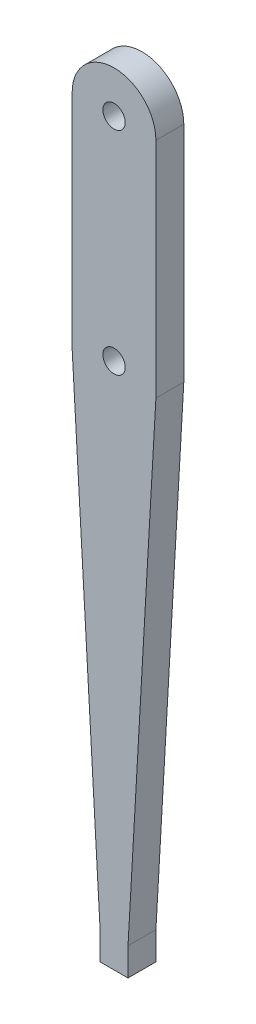
ISO-10303-21;
HEADER;
FILE_DESCRIPTION(('STEP AP214'),'2;1');
FILE_NAME('part.step','',(''),(''),'','','');
FILE_SCHEMA(('AUTOMOTIVE_DESIGN { 1 0 10303 214 1 1 1 1 }'));
ENDSEC;
DATA;
#1=APPLICATION_CONTEXT('core data for automotive mechanical design processes');
#2=APPLICATION_PROTOCOL_DEFINITION('international standard','automotive_design',2000,#1);
#3=PRODUCT_CONTEXT('',#1,'mechanical');
#4=PRODUCT('Part','Part','',(#3));
#5=PRODUCT_RELATED_PRODUCT_CATEGORY('part','',(#4));
#6=PRODUCT_DEFINITION_FORMATION('','',#4);
#7=PRODUCT_DEFINITION_CONTEXT('part definition',#1,'design');
#8=PRODUCT_DEFINITION('design','',#6,#7);
#9=PRODUCT_DEFINITION_SHAPE('','',#8);
#10=(LENGTH_UNIT() NAMED_UNIT(*) SI_UNIT(.MILLI.,.METRE.));
#11=(NAMED_UNIT(*) PLANE_ANGLE_UNIT() SI_UNIT($,.RADIAN.));
#12=(NAMED_UNIT(*) SI_UNIT($,.STERADIAN.) SOLID_ANGLE_UNIT());
#13=UNCERTAINTY_MEASURE_WITH_UNIT(LENGTH_MEASURE(1.E-05),#10,'distance_accuracy_value','');
#14=(GEOMETRIC_REPRESENTATION_CONTEXT(3) GLOBAL_UNCERTAINTY_ASSIGNED_CONTEXT((#13)) GLOBAL_UNIT_ASSIGNED_CONTEXT((#10,
#11,#12)) REPRESENTATION_CONTEXT('',''));
#15=CARTESIAN_POINT('',(0.,0.,0.));
#16=DIRECTION('',(0.,0.,1.));
#17=DIRECTION('',(1.,0.,0.));
#18=AXIS2_PLACEMENT_3D('',#15,#16,#17);
#19=CARTESIAN_POINT('',(0.,0.,5.));
#20=DIRECTION('',(0.,0.,1.));
#21=DIRECTION('',(1.,0.,0.));
#22=AXIS2_PLACEMENT_3D('',#19,#20,#21);
#23=PLANE('',#22);
#24=CARTESIAN_POINT('',(0.,-38.,5.));
#25=DIRECTION('',(0.,0.,1.));
#26=DIRECTION('',(1.,0.,0.));
#27=AXIS2_PLACEMENT_3D('',#24,#25,#26);
#28=CIRCLE('',#27,2.);
#29=CARTESIAN_POINT('',(2.00000000000001,-38.,5.));
#30=VERTEX_POINT('',#29);
#31=EDGE_CURVE('E133',#30,#30,#28,.T.);
#32=ORIENTED_EDGE('',*,*,#31,.F.);
#33=EDGE_LOOP('',(#32));
#34=FACE_BOUND('',#33,.T.);
#35=DIRECTION('',(0.0570530156877446,-0.998371150124509,0.));
#36=VECTOR('',#35,1.);
#37=CARTESIAN_POINT('',(-7.49999999999999,-40.,5.));
#38=LINE('',#37,#36);
#39=CARTESIAN_POINT('',(-7.49999999999999,-40.,5.));
#40=VERTEX_POINT('',#39);
#41=CARTESIAN_POINT('',(-2.49971641602917,-127.5,5.));
#42=VERTEX_POINT('',#41);
#43=EDGE_CURVE('E144',#40,#42,#38,.T.);
#44=ORIENTED_EDGE('',*,*,#43,.T.);
#45=DIRECTION('',(0.,-1.,0.));
#46=VECTOR('',#45,1.);
#47=CARTESIAN_POINT('',(-2.49971641602917,-132.5,5.));
#48=LINE('',#47,#46);
#49=CARTESIAN_POINT('',(-2.49971641602917,-132.5,5.));
#50=VERTEX_POINT('',#49);
#51=EDGE_CURVE('E92',#42,#50,#48,.T.);
#52=ORIENTED_EDGE('',*,*,#51,.T.);
#53=DIRECTION('',(1.,0.,0.));
#54=VECTOR('',#53,1.);
#55=CARTESIAN_POINT('',(-2.49971641602917,-132.5,5.));
#56=LINE('',#55,#54);
#57=CARTESIAN_POINT('',(2.4997164160292,-132.5,5.));
#58=VERTEX_POINT('',#57);
#59=EDGE_CURVE('E159',#50,#58,#56,.T.);
#60=ORIENTED_EDGE('',*,*,#59,.T.);
#61=DIRECTION('',(0.,1.,0.));
#62=VECTOR('',#61,1.);
#63=CARTESIAN_POINT('',(2.4997164160292,-132.5,5.));
#64=LINE('',#63,#62);
#65=CARTESIAN_POINT('',(2.4997164160292,-127.5,5.));
#66=VERTEX_POINT('',#65);
#67=EDGE_CURVE('E172',#58,#66,#64,.T.);
#68=ORIENTED_EDGE('',*,*,#67,.T.);
#69=DIRECTION('',(0.0570530156877444,0.998371150124509,0.));
#70=VECTOR('',#69,1.);
#71=CARTESIAN_POINT('',(7.50000000000001,-40.,5.));
#72=LINE('',#71,#70);
#73=CARTESIAN_POINT('',(7.50000000000001,-40.,5.));
#74=VERTEX_POINT('',#73);
#75=EDGE_CURVE('E111',#66,#74,#72,.T.);
#76=ORIENTED_EDGE('',*,*,#75,.T.);
#77=DIRECTION('',(0.,1.,0.));
#78=VECTOR('',#77,1.);
#79=CARTESIAN_POINT('',(7.5,0.,5.));
#80=LINE('',#79,#78);
#81=CARTESIAN_POINT('',(7.5,0.,5.));
#82=VERTEX_POINT('',#81);
#83=EDGE_CURVE('E105',#74,#82,#80,.T.);
#84=ORIENTED_EDGE('',*,*,#83,.T.);
#85=CARTESIAN_POINT('',(0.,0.,5.));
#86=DIRECTION('',(0.,0.,1.));
#87=DIRECTION('',(1.,0.,0.));
#88=AXIS2_PLACEMENT_3D('',#85,#86,#87);
#89=CIRCLE('',#88,7.5);
#90=CARTESIAN_POINT('',(-7.5,0.,5.));
#91=VERTEX_POINT('',#90);
#92=EDGE_CURVE('E109',#82,#91,#89,.T.);
#93=ORIENTED_EDGE('',*,*,#92,.T.);
#94=DIRECTION('',(0.,-1.,0.));
#95=VECTOR('',#94,1.);
#96=CARTESIAN_POINT('',(-7.49999999999999,-40.,5.));
#97=LINE('',#96,#95);
#98=EDGE_CURVE('E49',#91,#40,#97,.T.);
#99=ORIENTED_EDGE('',*,*,#98,.T.);
#100=EDGE_LOOP('',(#44,#52,#60,#68,#76,#84,#93,#99));
#101=FACE_BOUND('',#100,.T.);
#102=CARTESIAN_POINT('',(0.,0.,5.));
#103=DIRECTION('',(0.,0.,1.));
#104=DIRECTION('',(1.,0.,0.));
#105=AXIS2_PLACEMENT_3D('',#102,#103,#104);
#106=CIRCLE('',#105,2.);
#107=CARTESIAN_POINT('',(2.,0.,5.));
#108=VERTEX_POINT('',#107);
#109=EDGE_CURVE('E181',#108,#108,#106,.T.);
#110=ORIENTED_EDGE('',*,*,#109,.F.);
#111=EDGE_LOOP('',(#110));
#112=FACE_BOUND('',#111,.T.);
#113=ADVANCED_FACE('F32',(#34,#101,#112),#23,.T.);
#114=CARTESIAN_POINT('',(0.,0.,0.));
#115=DIRECTION('',(0.,0.,1.));
#116=DIRECTION('',(1.,0.,0.));
#117=AXIS2_PLACEMENT_3D('',#114,#115,#116);
#118=PLANE('',#117);
#119=CARTESIAN_POINT('',(0.,-38.,0.));
#120=DIRECTION('',(0.,0.,1.));
#121=DIRECTION('',(1.,0.,0.));
#122=AXIS2_PLACEMENT_3D('',#119,#120,#121);
#123=CIRCLE('',#122,2.);
#124=CARTESIAN_POINT('',(2.00000000000001,-38.,0.));
#125=VERTEX_POINT('',#124);
#126=EDGE_CURVE('E178',#125,#125,#123,.T.);
#127=ORIENTED_EDGE('',*,*,#126,.T.);
#128=EDGE_LOOP('',(#127));
#129=FACE_BOUND('',#128,.T.);
#130=DIRECTION('',(0.0570530156877446,-0.998371150124509,0.));
#131=VECTOR('',#130,1.);
#132=CARTESIAN_POINT('',(-7.49999999999999,-40.,0.));
#133=LINE('',#132,#131);
#134=CARTESIAN_POINT('',(-7.49999999999999,-40.,0.));
#135=VERTEX_POINT('',#134);
#136=CARTESIAN_POINT('',(-2.49971641602917,-127.5,0.));
#137=VERTEX_POINT('',#136);
#138=EDGE_CURVE('E129',#135,#137,#133,.T.);
#139=ORIENTED_EDGE('',*,*,#138,.F.);
#140=DIRECTION('',(0.,-1.,0.));
#141=VECTOR('',#140,1.);
#142=CARTESIAN_POINT('',(-7.49999999999999,-40.,0.));
#143=LINE('',#142,#141);
#144=CARTESIAN_POINT('',(-7.5,0.,0.));
#145=VERTEX_POINT('',#144);
#146=EDGE_CURVE('E84',#145,#135,#143,.T.);
#147=ORIENTED_EDGE('',*,*,#146,.F.);
#148=CARTESIAN_POINT('',(0.,0.,0.));
#149=DIRECTION('',(0.,0.,1.));
#150=DIRECTION('',(1.,0.,0.));
#151=AXIS2_PLACEMENT_3D('',#148,#149,#150);
#152=CIRCLE('',#151,7.5);
#153=CARTESIAN_POINT('',(7.5,0.,0.));
#154=VERTEX_POINT('',#153);
#155=EDGE_CURVE('E78',#154,#145,#152,.T.);
#156=ORIENTED_EDGE('',*,*,#155,.F.);
#157=DIRECTION('',(0.,1.,0.));
#158=VECTOR('',#157,1.);
#159=CARTESIAN_POINT('',(7.5,0.,0.));
#160=LINE('',#159,#158);
#161=CARTESIAN_POINT('',(7.50000000000001,-40.,0.));
#162=VERTEX_POINT('',#161);
#163=EDGE_CURVE('E119',#162,#154,#160,.T.);
#164=ORIENTED_EDGE('',*,*,#163,.F.);
#165=DIRECTION('',(0.0570530156877444,0.998371150124509,0.));
#166=VECTOR('',#165,1.);
#167=CARTESIAN_POINT('',(7.50000000000001,-40.,0.));
#168=LINE('',#167,#166);
#169=CARTESIAN_POINT('',(2.4997164160292,-127.5,0.));
#170=VERTEX_POINT('',#169);
#171=EDGE_CURVE('E139',#170,#162,#168,.T.);
#172=ORIENTED_EDGE('',*,*,#171,.F.);
#173=DIRECTION('',(0.,1.,0.));
#174=VECTOR('',#173,1.);
#175=CARTESIAN_POINT('',(2.4997164160292,-132.5,0.));
#176=LINE('',#175,#174);
#177=CARTESIAN_POINT('',(2.4997164160292,-132.5,0.));
#178=VERTEX_POINT('',#177);
#179=EDGE_CURVE('E137',#178,#170,#176,.T.);
#180=ORIENTED_EDGE('',*,*,#179,.F.);
#181=DIRECTION('',(1.,0.,0.));
#182=VECTOR('',#181,1.);
#183=CARTESIAN_POINT('',(-2.49971641602917,-132.5,0.));
#184=LINE('',#183,#182);
#185=CARTESIAN_POINT('',(-2.49971641602917,-132.5,0.));
#186=VERTEX_POINT('',#185);
#187=EDGE_CURVE('E135',#186,#178,#184,.T.);
#188=ORIENTED_EDGE('',*,*,#187,.F.);
#189=DIRECTION('',(0.,-1.,0.));
#190=VECTOR('',#189,1.);
#191=CARTESIAN_POINT('',(-2.49971641602917,-132.5,0.));
#192=LINE('',#191,#190);
#193=EDGE_CURVE('E132',#137,#186,#192,.T.);
#194=ORIENTED_EDGE('',*,*,#193,.F.);
#195=EDGE_LOOP('',(#139,#147,#156,#164,#172,#180,#188,#194));
#196=FACE_BOUND('',#195,.T.);
#197=CARTESIAN_POINT('',(0.,0.,0.));
#198=DIRECTION('',(0.,0.,1.));
#199=DIRECTION('',(1.,0.,0.));
#200=AXIS2_PLACEMENT_3D('',#197,#198,#199);
#201=CIRCLE('',#200,2.);
#202=CARTESIAN_POINT('',(2.,0.,0.));
#203=VERTEX_POINT('',#202);
#204=EDGE_CURVE('E184',#203,#203,#201,.T.);
#205=ORIENTED_EDGE('',*,*,#204,.T.);
#206=EDGE_LOOP('',(#205));
#207=FACE_BOUND('',#206,.T.);
#208=ADVANCED_FACE('F163',(#129,#196,#207),#118,.F.);
#209=CARTESIAN_POINT('',(-7.49999999999999,-40.,5.));
#210=DIRECTION('',(0.998371150124508,0.0570530156877446,0.));
#211=DIRECTION('',(-0.0570530156877446,0.998371150124509,0.));
#212=AXIS2_PLACEMENT_3D('',#209,#210,#211);
#213=PLANE('',#212);
#214=ORIENTED_EDGE('',*,*,#138,.T.);
#215=DIRECTION('',(0.,0.,-1.));
#216=VECTOR('',#215,1.);
#217=CARTESIAN_POINT('',(-2.49971641602917,-127.5,5.));
#218=LINE('',#217,#216);
#219=EDGE_CURVE('E11',#42,#137,#218,.T.);
#220=ORIENTED_EDGE('',*,*,#219,.F.);
#221=ORIENTED_EDGE('',*,*,#43,.F.);
#222=DIRECTION('',(0.,0.,-1.));
#223=VECTOR('',#222,1.);
#224=CARTESIAN_POINT('',(-7.49999999999999,-40.,5.));
#225=LINE('',#224,#223);
#226=EDGE_CURVE('E125',#40,#135,#225,.T.);
#227=ORIENTED_EDGE('',*,*,#226,.T.);
#228=EDGE_LOOP('',(#214,#220,#221,#227));
#229=FACE_BOUND('',#228,.T.);
#230=ADVANCED_FACE('F34',(#229),#213,.F.);
#231=CARTESIAN_POINT('',(-2.49971641602917,-132.5,5.));
#232=DIRECTION('',(1.,0.,0.));
#233=DIRECTION('',(0.,1.,0.));
#234=AXIS2_PLACEMENT_3D('',#231,#232,#233);
#235=PLANE('',#234);
#236=ORIENTED_EDGE('',*,*,#193,.T.);
#237=DIRECTION('',(0.,0.,-1.));
#238=VECTOR('',#237,1.);
#239=CARTESIAN_POINT('',(-2.49971641602917,-132.5,5.));
#240=LINE('',#239,#238);
#241=EDGE_CURVE('E41',#50,#186,#240,.T.);
#242=ORIENTED_EDGE('',*,*,#241,.F.);
#243=ORIENTED_EDGE('',*,*,#51,.F.);
#244=ORIENTED_EDGE('',*,*,#219,.T.);
#245=EDGE_LOOP('',(#236,#242,#243,#244));
#246=FACE_BOUND('',#245,.T.);
#247=ADVANCED_FACE('F217',(#246),#235,.F.);
#248=CARTESIAN_POINT('',(-2.49971641602917,-132.5,5.));
#249=DIRECTION('',(0.,1.,0.));
#250=DIRECTION('',(0.,0.,1.));
#251=AXIS2_PLACEMENT_3D('',#248,#249,#250);
#252=PLANE('',#251);
#253=ORIENTED_EDGE('',*,*,#187,.T.);
#254=DIRECTION('',(0.,0.,-1.));
#255=VECTOR('',#254,1.);
#256=CARTESIAN_POINT('',(2.4997164160292,-132.5,5.));
#257=LINE('',#256,#255);
#258=EDGE_CURVE('E151',#58,#178,#257,.T.);
#259=ORIENTED_EDGE('',*,*,#258,.F.);
#260=ORIENTED_EDGE('',*,*,#59,.F.);
#261=ORIENTED_EDGE('',*,*,#241,.T.);
#262=EDGE_LOOP('',(#253,#259,#260,#261));
#263=FACE_BOUND('',#262,.T.);
#264=ADVANCED_FACE('F157',(#263),#252,.F.);
#265=CARTESIAN_POINT('',(2.4997164160292,-132.5,5.));
#266=DIRECTION('',(-1.,0.,0.));
#267=DIRECTION('',(0.,0.,1.));
#268=AXIS2_PLACEMENT_3D('',#265,#266,#267);
#269=PLANE('',#268);
#270=ORIENTED_EDGE('',*,*,#179,.T.);
#271=DIRECTION('',(0.,0.,-1.));
#272=VECTOR('',#271,1.);
#273=CARTESIAN_POINT('',(2.4997164160292,-127.5,5.));
#274=LINE('',#273,#272);
#275=EDGE_CURVE('E148',#66,#170,#274,.T.);
#276=ORIENTED_EDGE('',*,*,#275,.F.);
#277=ORIENTED_EDGE('',*,*,#67,.F.);
#278=ORIENTED_EDGE('',*,*,#258,.T.);
#279=EDGE_LOOP('',(#270,#276,#277,#278));
#280=FACE_BOUND('',#279,.T.);
#281=ADVANCED_FACE('F168',(#280),#269,.F.);
#282=CARTESIAN_POINT('',(7.50000000000001,-40.,5.));
#283=DIRECTION('',(-0.998371150124508,0.0570530156877444,0.));
#284=DIRECTION('',(-0.0570530156877444,-0.998371150124509,0.));
#285=AXIS2_PLACEMENT_3D('',#282,#283,#284);
#286=PLANE('',#285);
#287=ORIENTED_EDGE('',*,*,#171,.T.);
#288=DIRECTION('',(0.,0.,-1.));
#289=VECTOR('',#288,1.);
#290=CARTESIAN_POINT('',(7.50000000000001,-40.,5.));
#291=LINE('',#290,#289);
#292=EDGE_CURVE('E120',#74,#162,#291,.T.);
#293=ORIENTED_EDGE('',*,*,#292,.F.);
#294=ORIENTED_EDGE('',*,*,#75,.F.);
#295=ORIENTED_EDGE('',*,*,#275,.T.);
#296=EDGE_LOOP('',(#287,#293,#294,#295));
#297=FACE_BOUND('',#296,.T.);
#298=ADVANCED_FACE('F171',(#297),#286,.F.);
#299=CARTESIAN_POINT('',(7.5,0.,5.));
#300=DIRECTION('',(-1.,0.,0.));
#301=DIRECTION('',(0.,-1.,0.));
#302=AXIS2_PLACEMENT_3D('',#299,#300,#301);
#303=PLANE('',#302);
#304=ORIENTED_EDGE('',*,*,#163,.T.);
#305=DIRECTION('',(0.,0.,-1.));
#306=VECTOR('',#305,1.);
#307=CARTESIAN_POINT('',(7.5,0.,5.));
#308=LINE('',#307,#306);
#309=EDGE_CURVE('E116',#82,#154,#308,.T.);
#310=ORIENTED_EDGE('',*,*,#309,.F.);
#311=ORIENTED_EDGE('',*,*,#83,.F.);
#312=ORIENTED_EDGE('',*,*,#292,.T.);
#313=EDGE_LOOP('',(#304,#310,#311,#312));
#314=FACE_BOUND('',#313,.T.);
#315=ADVANCED_FACE('F117',(#314),#303,.F.);
#316=CARTESIAN_POINT('',(0.,0.,5.));
#317=DIRECTION('',(0.,0.,-1.));
#318=DIRECTION('',(-1.,0.,0.));
#319=AXIS2_PLACEMENT_3D('',#316,#317,#318);
#320=CYLINDRICAL_SURFACE('',#319,7.5);
#321=ORIENTED_EDGE('',*,*,#155,.T.);
#322=DIRECTION('',(0.,0.,-1.));
#323=VECTOR('',#322,1.);
#324=CARTESIAN_POINT('',(-7.5,0.,5.));
#325=LINE('',#324,#323);
#326=EDGE_CURVE('E121',#91,#145,#325,.T.);
#327=ORIENTED_EDGE('',*,*,#326,.F.);
#328=ORIENTED_EDGE('',*,*,#92,.F.);
#329=ORIENTED_EDGE('',*,*,#309,.T.);
#330=EDGE_LOOP('',(#321,#327,#328,#329));
#331=FACE_BOUND('',#330,.T.);
#332=ADVANCED_FACE('F123',(#331),#320,.T.);
#333=CARTESIAN_POINT('',(-7.49999999999999,-40.,5.));
#334=DIRECTION('',(1.,0.,0.));
#335=DIRECTION('',(0.,1.,0.));
#336=AXIS2_PLACEMENT_3D('',#333,#334,#335);
#337=PLANE('',#336);
#338=ORIENTED_EDGE('',*,*,#146,.T.);
#339=ORIENTED_EDGE('',*,*,#226,.F.);
#340=ORIENTED_EDGE('',*,*,#98,.F.);
#341=ORIENTED_EDGE('',*,*,#326,.T.);
#342=EDGE_LOOP('',(#338,#339,#340,#341));
#343=FACE_BOUND('',#342,.T.);
#344=ADVANCED_FACE('F205',(#343),#337,.F.);
#345=CARTESIAN_POINT('',(0.,-38.,5.));
#346=DIRECTION('',(0.,0.,-1.));
#347=DIRECTION('',(-1.,0.,0.));
#348=AXIS2_PLACEMENT_3D('',#345,#346,#347);
#349=CYLINDRICAL_SURFACE('',#348,2.);
#350=ORIENTED_EDGE('',*,*,#31,.T.);
#351=EDGE_LOOP('',(#350));
#352=FACE_BOUND('',#351,.T.);
#353=ORIENTED_EDGE('',*,*,#126,.F.);
#354=EDGE_LOOP('',(#353));
#355=FACE_BOUND('',#354,.T.);
#356=ADVANCED_FACE('F202',(#352,#355),#349,.F.);
#357=CARTESIAN_POINT('',(0.,0.,5.));
#358=DIRECTION('',(0.,0.,-1.));
#359=DIRECTION('',(-1.,0.,0.));
#360=AXIS2_PLACEMENT_3D('',#357,#358,#359);
#361=CYLINDRICAL_SURFACE('',#360,2.);
#362=ORIENTED_EDGE('',*,*,#109,.T.);
#363=EDGE_LOOP('',(#362));
#364=FACE_BOUND('',#363,.T.);
#365=ORIENTED_EDGE('',*,*,#204,.F.);
#366=EDGE_LOOP('',(#365));
#367=FACE_BOUND('',#366,.T.);
#368=ADVANCED_FACE('F190',(#364,#367),#361,.F.);
#369=CLOSED_SHELL('',(#113,#208,#230,#247,#264,#281,#298,#315,#332,#344,#356,#368));
#370=MANIFOLD_SOLID_BREP('B2',#369);
#371=ADVANCED_BREP_SHAPE_REPRESENTATION('',(#18,#370),#14);
#372=SHAPE_DEFINITION_REPRESENTATION(#9,#371);
ENDSEC;
END-ISO-10303-21;
